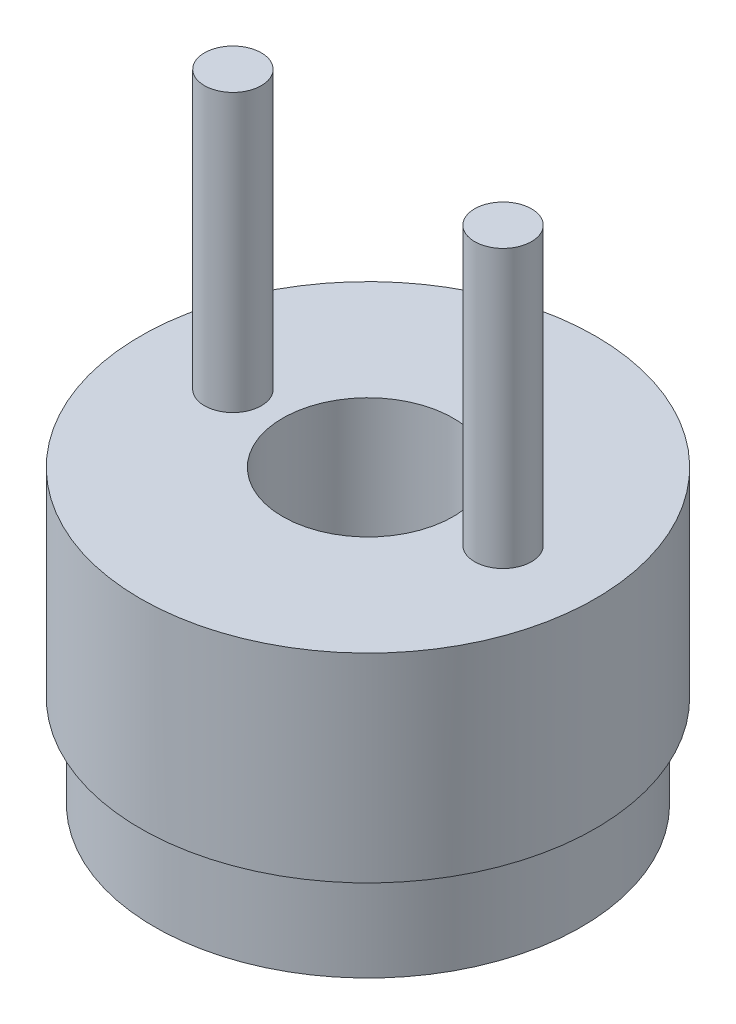
ISO-10303-21;
HEADER;
FILE_DESCRIPTION(('STEP AP214'),'2;1');
FILE_NAME('part.step','',(''),(''),'','','');
FILE_SCHEMA(('AUTOMOTIVE_DESIGN { 1 0 10303 214 1 1 1 1 }'));
ENDSEC;
DATA;
#1=APPLICATION_CONTEXT('core data for automotive mechanical design processes');
#2=APPLICATION_PROTOCOL_DEFINITION('international standard','automotive_design',2000,#1);
#3=PRODUCT_CONTEXT('',#1,'mechanical');
#4=PRODUCT('Part','Part','',(#3));
#5=PRODUCT_RELATED_PRODUCT_CATEGORY('part','',(#4));
#6=PRODUCT_DEFINITION_FORMATION('','',#4);
#7=PRODUCT_DEFINITION_CONTEXT('part definition',#1,'design');
#8=PRODUCT_DEFINITION('design','',#6,#7);
#9=PRODUCT_DEFINITION_SHAPE('','',#8);
#10=(LENGTH_UNIT() NAMED_UNIT(*) SI_UNIT(.MILLI.,.METRE.));
#11=(NAMED_UNIT(*) PLANE_ANGLE_UNIT() SI_UNIT($,.RADIAN.));
#12=(NAMED_UNIT(*) SI_UNIT($,.STERADIAN.) SOLID_ANGLE_UNIT());
#13=UNCERTAINTY_MEASURE_WITH_UNIT(LENGTH_MEASURE(1.E-05),#10,'distance_accuracy_value','');
#14=(GEOMETRIC_REPRESENTATION_CONTEXT(3) GLOBAL_UNCERTAINTY_ASSIGNED_CONTEXT((#13)) GLOBAL_UNIT_ASSIGNED_CONTEXT((#10,
#11,#12)) REPRESENTATION_CONTEXT('',''));
#15=CARTESIAN_POINT('',(0.,0.,0.));
#16=DIRECTION('',(0.,0.,1.));
#17=DIRECTION('',(1.,0.,0.));
#18=AXIS2_PLACEMENT_3D('',#15,#16,#17);
#19=CARTESIAN_POINT('',(9.5,59.5,0.));
#20=DIRECTION('',(0.,-1.,0.));
#21=DIRECTION('',(0.,0.,-1.));
#22=AXIS2_PLACEMENT_3D('',#19,#20,#21);
#23=CYLINDRICAL_SURFACE('',#22,2.);
#24=CARTESIAN_POINT('',(9.5,59.5,0.));
#25=DIRECTION('',(0.,1.,0.));
#26=DIRECTION('',(0.,0.,-1.));
#27=AXIS2_PLACEMENT_3D('',#24,#25,#26);
#28=CIRCLE('',#27,2.);
#29=CARTESIAN_POINT('',(9.5,59.5,-2.));
#30=VERTEX_POINT('',#29);
#31=EDGE_CURVE('E11',#30,#30,#28,.T.);
#32=ORIENTED_EDGE('',*,*,#31,.F.);
#33=EDGE_LOOP('',(#32));
#34=FACE_BOUND('',#33,.T.);
#35=CARTESIAN_POINT('',(9.5,19.5,0.));
#36=DIRECTION('',(0.,1.,0.));
#37=DIRECTION('',(0.,0.,-1.));
#38=AXIS2_PLACEMENT_3D('',#35,#36,#37);
#39=CIRCLE('',#38,2.);
#40=CARTESIAN_POINT('',(9.5,19.5,-2.));
#41=VERTEX_POINT('',#40);
#42=EDGE_CURVE('E45',#41,#41,#39,.T.);
#43=ORIENTED_EDGE('',*,*,#42,.T.);
#44=EDGE_LOOP('',(#43));
#45=FACE_BOUND('',#44,.T.);
#46=ADVANCED_FACE('F42',(#34,#45),#23,.T.);
#47=CARTESIAN_POINT('',(9.5,59.5,0.));
#48=DIRECTION('',(0.,-1.,0.));
#49=DIRECTION('',(0.,0.,-1.));
#50=AXIS2_PLACEMENT_3D('',#47,#48,#49);
#51=PLANE('',#50);
#52=ORIENTED_EDGE('',*,*,#31,.T.);
#53=EDGE_LOOP('',(#52));
#54=FACE_BOUND('',#53,.T.);
#55=ADVANCED_FACE('F57',(#54),#51,.F.);
#56=CARTESIAN_POINT('',(9.5,19.5,0.));
#57=DIRECTION('',(0.,-1.,0.));
#58=DIRECTION('',(0.,0.,-1.));
#59=AXIS2_PLACEMENT_3D('',#56,#57,#58);
#60=PLANE('',#59);
#61=ORIENTED_EDGE('',*,*,#42,.F.);
#62=EDGE_LOOP('',(#61));
#63=FACE_BOUND('',#62,.T.);
#64=ADVANCED_FACE('F55',(#63),#60,.T.);
#65=CLOSED_SHELL('',(#46,#55,#64));
#66=MANIFOLD_SOLID_BREP('B2',#65);
#67=CARTESIAN_POINT('',(-9.5,59.5,0.));
#68=DIRECTION('',(0.,-1.,0.));
#69=DIRECTION('',(0.,0.,-1.));
#70=AXIS2_PLACEMENT_3D('',#67,#68,#69);
#71=CYLINDRICAL_SURFACE('',#70,2.);
#72=CARTESIAN_POINT('',(-9.5,59.5,0.));
#73=DIRECTION('',(0.,1.,0.));
#74=DIRECTION('',(0.,0.,1.));
#75=AXIS2_PLACEMENT_3D('',#72,#73,#74);
#76=CIRCLE('',#75,2.);
#77=CARTESIAN_POINT('',(-9.5,59.5,2.));
#78=VERTEX_POINT('',#77);
#79=EDGE_CURVE('E41',#78,#78,#76,.T.);
#80=ORIENTED_EDGE('',*,*,#79,.F.);
#81=EDGE_LOOP('',(#80));
#82=FACE_BOUND('',#81,.T.);
#83=CARTESIAN_POINT('',(-9.5,19.5,0.));
#84=DIRECTION('',(0.,1.,0.));
#85=DIRECTION('',(0.,0.,1.));
#86=AXIS2_PLACEMENT_3D('',#83,#84,#85);
#87=CIRCLE('',#86,2.);
#88=CARTESIAN_POINT('',(-9.5,19.5,2.));
#89=VERTEX_POINT('',#88);
#90=EDGE_CURVE('E93',#89,#89,#87,.T.);
#91=ORIENTED_EDGE('',*,*,#90,.T.);
#92=EDGE_LOOP('',(#91));
#93=FACE_BOUND('',#92,.T.);
#94=ADVANCED_FACE('F90',(#82,#93),#71,.T.);
#95=CARTESIAN_POINT('',(-9.5,59.5,0.));
#96=DIRECTION('',(0.,1.,0.));
#97=DIRECTION('',(0.,0.,1.));
#98=AXIS2_PLACEMENT_3D('',#95,#96,#97);
#99=PLANE('',#98);
#100=ORIENTED_EDGE('',*,*,#79,.T.);
#101=EDGE_LOOP('',(#100));
#102=FACE_BOUND('',#101,.T.);
#103=ADVANCED_FACE('F105',(#102),#99,.T.);
#104=CARTESIAN_POINT('',(-9.5,19.5,0.));
#105=DIRECTION('',(0.,1.,0.));
#106=DIRECTION('',(0.,0.,1.));
#107=AXIS2_PLACEMENT_3D('',#104,#105,#106);
#108=PLANE('',#107);
#109=ORIENTED_EDGE('',*,*,#90,.F.);
#110=EDGE_LOOP('',(#109));
#111=FACE_BOUND('',#110,.T.);
#112=ADVANCED_FACE('F103',(#111),#108,.F.);
#113=CLOSED_SHELL('',(#94,#103,#112));
#114=MANIFOLD_SOLID_BREP('B6',#113);
#115=CARTESIAN_POINT('',(0.,0.,0.));
#116=DIRECTION('',(0.,1.,0.));
#117=DIRECTION('',(0.,0.,1.));
#118=AXIS2_PLACEMENT_3D('',#115,#116,#117);
#119=CYLINDRICAL_SURFACE('',#118,6.);
#120=CARTESIAN_POINT('',(0.,40.,0.));
#121=DIRECTION('',(0.,1.,0.));
#122=DIRECTION('',(0.,0.,1.));
#123=AXIS2_PLACEMENT_3D('',#120,#121,#122);
#124=CIRCLE('',#123,6.);
#125=CARTESIAN_POINT('',(0.,40.,6.));
#126=VERTEX_POINT('',#125);
#127=EDGE_CURVE('E139',#126,#126,#124,.T.);
#128=ORIENTED_EDGE('',*,*,#127,.T.);
#129=EDGE_LOOP('',(#128));
#130=FACE_BOUND('',#129,.T.);
#131=CARTESIAN_POINT('',(0.,19.5,0.));
#132=DIRECTION('',(0.,-1.,0.));
#133=DIRECTION('',(0.,0.,-1.));
#134=AXIS2_PLACEMENT_3D('',#131,#132,#133);
#135=CIRCLE('',#134,6.);
#136=CARTESIAN_POINT('',(0.,19.5,-6.));
#137=VERTEX_POINT('',#136);
#138=EDGE_CURVE('E167',#137,#137,#135,.F.);
#139=ORIENTED_EDGE('',*,*,#138,.F.);
#140=EDGE_LOOP('',(#139));
#141=FACE_BOUND('',#140,.T.);
#142=ADVANCED_FACE('F131',(#130,#141),#119,.F.);
#143=CARTESIAN_POINT('',(0.,26.,0.));
#144=DIRECTION('',(0.,-1.,0.));
#145=DIRECTION('',(0.,0.,-1.));
#146=AXIS2_PLACEMENT_3D('',#143,#144,#145);
#147=CYLINDRICAL_SURFACE('',#146,15.);
#148=CARTESIAN_POINT('',(0.,26.,0.));
#149=DIRECTION('',(0.,-1.,0.));
#150=DIRECTION('',(0.,0.,-1.));
#151=AXIS2_PLACEMENT_3D('',#148,#149,#150);
#152=CIRCLE('',#151,15.);
#153=CARTESIAN_POINT('',(0.,26.,-15.));
#154=VERTEX_POINT('',#153);
#155=EDGE_CURVE('E149',#154,#154,#152,.T.);
#156=CARTESIAN_POINT('',(0.,19.5,0.));
#157=DIRECTION('',(0.,-1.,0.));
#158=DIRECTION('',(0.,0.,-1.));
#159=AXIS2_PLACEMENT_3D('',#156,#157,#158);
#160=CIRCLE('',#159,15.);
#161=CARTESIAN_POINT('',(0.,19.5,-15.));
#162=VERTEX_POINT('',#161);
#163=EDGE_CURVE('E157',#162,#162,#160,.T.);
#164=CARTESIAN_POINT('',(0.,26.,-15.));
#165=CARTESIAN_POINT('',(0.,25.9322916666667,-15.));
#166=CARTESIAN_POINT('',(0.,25.8645833333333,-15.));
#167=CARTESIAN_POINT('',(0.,25.7291666666667,-15.));
#168=CARTESIAN_POINT('',(0.,25.6614583333333,-15.));
#169=CARTESIAN_POINT('',(0.,25.5260416666667,-15.));
#170=CARTESIAN_POINT('',(0.,25.4583333333333,-15.));
#171=CARTESIAN_POINT('',(0.,25.3229166666667,-15.));
#172=CARTESIAN_POINT('',(0.,25.2552083333333,-15.));
#173=CARTESIAN_POINT('',(0.,25.1197916666667,-15.));
#174=CARTESIAN_POINT('',(0.,25.0520833333333,-15.));
#175=CARTESIAN_POINT('',(0.,24.9166666666667,-15.));
#176=CARTESIAN_POINT('',(0.,24.8489583333333,-15.));
#177=CARTESIAN_POINT('',(0.,24.7135416666667,-15.));
#178=CARTESIAN_POINT('',(0.,24.6458333333333,-15.));
#179=CARTESIAN_POINT('',(0.,24.5104166666667,-15.));
#180=CARTESIAN_POINT('',(0.,24.4427083333333,-15.));
#181=CARTESIAN_POINT('',(0.,24.3072916666667,-15.));
#182=CARTESIAN_POINT('',(0.,24.2395833333333,-15.));
#183=CARTESIAN_POINT('',(0.,24.1041666666667,-15.));
#184=CARTESIAN_POINT('',(0.,24.0364583333333,-15.));
#185=CARTESIAN_POINT('',(0.,23.9010416666667,-15.));
#186=CARTESIAN_POINT('',(0.,23.8333333333333,-15.));
#187=CARTESIAN_POINT('',(0.,23.6979166666667,-15.));
#188=CARTESIAN_POINT('',(0.,23.6302083333333,-15.));
#189=CARTESIAN_POINT('',(0.,23.4947916666667,-15.));
#190=CARTESIAN_POINT('',(0.,23.4270833333333,-15.));
#191=CARTESIAN_POINT('',(0.,23.2916666666667,-15.));
#192=CARTESIAN_POINT('',(0.,23.2239583333333,-15.));
#193=CARTESIAN_POINT('',(0.,23.0885416666667,-15.));
#194=CARTESIAN_POINT('',(0.,23.0208333333333,-15.));
#195=CARTESIAN_POINT('',(0.,22.8854166666667,-15.));
#196=CARTESIAN_POINT('',(0.,22.8177083333333,-15.));
#197=CARTESIAN_POINT('',(0.,22.6822916666667,-15.));
#198=CARTESIAN_POINT('',(0.,22.6145833333333,-15.));
#199=CARTESIAN_POINT('',(0.,22.4791666666667,-15.));
#200=CARTESIAN_POINT('',(0.,22.4114583333333,-15.));
#201=CARTESIAN_POINT('',(0.,22.2760416666667,-15.));
#202=CARTESIAN_POINT('',(0.,22.2083333333333,-15.));
#203=CARTESIAN_POINT('',(0.,22.0729166666667,-15.));
#204=CARTESIAN_POINT('',(0.,22.0052083333333,-15.));
#205=CARTESIAN_POINT('',(0.,21.8697916666667,-15.));
#206=CARTESIAN_POINT('',(0.,21.8020833333333,-15.));
#207=CARTESIAN_POINT('',(0.,21.6666666666667,-15.));
#208=CARTESIAN_POINT('',(0.,21.5989583333333,-15.));
#209=CARTESIAN_POINT('',(0.,21.4635416666667,-15.));
#210=CARTESIAN_POINT('',(0.,21.3958333333333,-15.));
#211=CARTESIAN_POINT('',(0.,21.2604166666667,-15.));
#212=CARTESIAN_POINT('',(0.,21.1927083333333,-15.));
#213=CARTESIAN_POINT('',(0.,21.0572916666667,-15.));
#214=CARTESIAN_POINT('',(0.,20.9895833333333,-15.));
#215=CARTESIAN_POINT('',(0.,20.8541666666667,-15.));
#216=CARTESIAN_POINT('',(0.,20.7864583333333,-15.));
#217=CARTESIAN_POINT('',(0.,20.6510416666667,-15.));
#218=CARTESIAN_POINT('',(0.,20.5833333333333,-15.));
#219=CARTESIAN_POINT('',(0.,20.4479166666667,-15.));
#220=CARTESIAN_POINT('',(0.,20.3802083333333,-15.));
#221=CARTESIAN_POINT('',(0.,20.2447916666667,-15.));
#222=CARTESIAN_POINT('',(0.,20.1770833333333,-15.));
#223=CARTESIAN_POINT('',(0.,20.0416666666667,-15.));
#224=CARTESIAN_POINT('',(0.,19.9739583333333,-15.));
#225=CARTESIAN_POINT('',(0.,19.8385416666667,-15.));
#226=CARTESIAN_POINT('',(0.,19.7708333333333,-15.));
#227=CARTESIAN_POINT('',(0.,19.6354166666667,-15.));
#228=CARTESIAN_POINT('',(0.,19.5677083333333,-15.));
#229=CARTESIAN_POINT('',(0.,19.5,-15.));
#230=B_SPLINE_CURVE_WITH_KNOTS('',3,(#164,#165,#166,#167,#168,#169,#170,#171,#172,#173,#174,
#175,#176,#177,#178,#179,#180,#181,#182,#183,#184,#185,#186,#187,#188,#189,#190,#191,#192,#193,
#194,#195,#196,#197,#198,#199,#200,#201,#202,#203,#204,#205,#206,#207,#208,#209,#210,#211,#212,
#213,#214,#215,#216,#217,#218,#219,#220,#221,#222,#223,#224,#225,#226,#227,#228,#229),
.UNSPECIFIED.,.F.,.F.,(4,2,2,2,2,2,2,2,2,2,2,2,2,2,2,2,2,2,2,2,2,2,2,2,2,2,2,2,2,2,2,2,4),(0.,
0.203124999999998,0.406249999999997,0.609374999999999,0.812499999999997,1.015625,1.21875,
1.421875,1.625,1.828125,2.03125,2.234375,2.4375,2.640625,2.84375,3.046875,3.25,3.453125,3.65625,
3.859375,4.0625,4.265625,4.46875,4.671875,4.875,5.078125,5.28125,5.484375,5.6875,5.890625,
6.09375,6.296875,6.5),.UNSPECIFIED.);
#231=EDGE_CURVE('BSEAM172',#154,#162,#230,.T.);
#232=ORIENTED_EDGE('',*,*,#155,.T.);
#233=ORIENTED_EDGE('',*,*,#163,.F.);
#234=ORIENTED_EDGE('',*,*,#231,.T.);
#235=ORIENTED_EDGE('',*,*,#231,.F.);
#236=EDGE_LOOP('',(#232,#234,#233,#235));
#237=FACE_BOUND('',#236,.T.);
#238=ADVANCED_FACE('F172',(#237),#147,.T.);
#239=CARTESIAN_POINT('',(0.,40.,0.));
#240=DIRECTION('',(0.,-1.,0.));
#241=DIRECTION('',(0.,0.,-1.));
#242=AXIS2_PLACEMENT_3D('',#239,#240,#241);
#243=CYLINDRICAL_SURFACE('',#242,16.);
#244=CARTESIAN_POINT('',(0.,40.,0.));
#245=DIRECTION('',(0.,1.,0.));
#246=DIRECTION('',(0.,0.,1.));
#247=AXIS2_PLACEMENT_3D('',#244,#245,#246);
#248=CIRCLE('',#247,16.);
#249=CARTESIAN_POINT('',(0.,40.,16.));
#250=VERTEX_POINT('',#249);
#251=EDGE_CURVE('E89',#250,#250,#248,.T.);
#252=ORIENTED_EDGE('',*,*,#251,.F.);
#253=EDGE_LOOP('',(#252));
#254=FACE_BOUND('',#253,.T.);
#255=CARTESIAN_POINT('',(0.,26.,0.));
#256=DIRECTION('',(0.,-1.,0.));
#257=DIRECTION('',(0.,0.,-1.));
#258=AXIS2_PLACEMENT_3D('',#255,#256,#257);
#259=CIRCLE('',#258,16.);
#260=CARTESIAN_POINT('',(0.,26.,-16.));
#261=VERTEX_POINT('',#260);
#262=EDGE_CURVE('E144',#261,#261,#259,.T.);
#263=ORIENTED_EDGE('',*,*,#262,.F.);
#264=EDGE_LOOP('',(#263));
#265=FACE_BOUND('',#264,.T.);
#266=ADVANCED_FACE('F133',(#254,#265),#243,.T.);
#267=CARTESIAN_POINT('',(0.,40.,0.));
#268=DIRECTION('',(0.,1.,0.));
#269=DIRECTION('',(0.,0.,1.));
#270=AXIS2_PLACEMENT_3D('',#267,#268,#269);
#271=PLANE('',#270);
#272=CARTESIAN_POINT('',(9.5,40.,0.));
#273=DIRECTION('',(0.,1.,0.));
#274=DIRECTION('',(0.,0.,1.));
#275=AXIS2_PLACEMENT_3D('',#272,#273,#274);
#276=CIRCLE('',#275,2.);
#277=CARTESIAN_POINT('',(9.5,40.,2.));
#278=VERTEX_POINT('',#277);
#279=EDGE_CURVE('E153',#278,#278,#276,.T.);
#280=ORIENTED_EDGE('',*,*,#279,.F.);
#281=EDGE_LOOP('',(#280));
#282=FACE_BOUND('',#281,.T.);
#283=CARTESIAN_POINT('',(-9.5,40.,0.));
#284=DIRECTION('',(0.,1.,0.));
#285=DIRECTION('',(0.,0.,1.));
#286=AXIS2_PLACEMENT_3D('',#283,#284,#285);
#287=CIRCLE('',#286,2.);
#288=CARTESIAN_POINT('',(-9.5,40.,2.));
#289=VERTEX_POINT('',#288);
#290=EDGE_CURVE('E152',#289,#289,#287,.T.);
#291=ORIENTED_EDGE('',*,*,#290,.F.);
#292=EDGE_LOOP('',(#291));
#293=FACE_BOUND('',#292,.T.);
#294=ORIENTED_EDGE('',*,*,#127,.F.);
#295=EDGE_LOOP('',(#294));
#296=FACE_BOUND('',#295,.T.);
#297=ORIENTED_EDGE('',*,*,#251,.T.);
#298=EDGE_LOOP('',(#297));
#299=FACE_BOUND('',#298,.T.);
#300=ADVANCED_FACE('F179',(#282,#293,#296,#299),#271,.T.);
#301=CARTESIAN_POINT('',(0.,26.,0.));
#302=DIRECTION('',(0.,-1.,0.));
#303=DIRECTION('',(0.,0.,-1.));
#304=AXIS2_PLACEMENT_3D('',#301,#302,#303);
#305=PLANE('',#304);
#306=ORIENTED_EDGE('',*,*,#155,.F.);
#307=EDGE_LOOP('',(#306));
#308=FACE_BOUND('',#307,.T.);
#309=ORIENTED_EDGE('',*,*,#262,.T.);
#310=EDGE_LOOP('',(#309));
#311=FACE_BOUND('',#310,.T.);
#312=ADVANCED_FACE('F175',(#308,#311),#305,.T.);
#313=CARTESIAN_POINT('',(0.,19.5,0.));
#314=DIRECTION('',(0.,-1.,0.));
#315=DIRECTION('',(0.,0.,-1.));
#316=AXIS2_PLACEMENT_3D('',#313,#314,#315);
#317=PLANE('',#316);
#318=CARTESIAN_POINT('',(9.5,19.5,0.));
#319=DIRECTION('',(0.,-1.,0.));
#320=DIRECTION('',(0.,0.,-1.));
#321=AXIS2_PLACEMENT_3D('',#318,#319,#320);
#322=CIRCLE('',#321,2.);
#323=CARTESIAN_POINT('',(9.5,19.5,-2.));
#324=VERTEX_POINT('',#323);
#325=EDGE_CURVE('E135',#324,#324,#322,.T.);
#326=ORIENTED_EDGE('',*,*,#325,.F.);
#327=EDGE_LOOP('',(#326));
#328=FACE_BOUND('',#327,.T.);
#329=CARTESIAN_POINT('',(-9.5,19.5,0.));
#330=DIRECTION('',(0.,-1.,0.));
#331=DIRECTION('',(0.,0.,-1.));
#332=AXIS2_PLACEMENT_3D('',#329,#330,#331);
#333=CIRCLE('',#332,2.);
#334=CARTESIAN_POINT('',(-9.5,19.5,-2.));
#335=VERTEX_POINT('',#334);
#336=EDGE_CURVE('E150',#335,#335,#333,.T.);
#337=ORIENTED_EDGE('',*,*,#336,.F.);
#338=EDGE_LOOP('',(#337));
#339=FACE_BOUND('',#338,.T.);
#340=ORIENTED_EDGE('',*,*,#163,.T.);
#341=EDGE_LOOP('',(#340));
#342=FACE_BOUND('',#341,.T.);
#343=ORIENTED_EDGE('',*,*,#138,.T.);
#344=EDGE_LOOP('',(#343));
#345=FACE_BOUND('',#344,.T.);
#346=ADVANCED_FACE('F178',(#328,#339,#342,#345),#317,.T.);
#347=CARTESIAN_POINT('',(-9.5,59.5,0.));
#348=DIRECTION('',(0.,-1.,0.));
#349=DIRECTION('',(0.,0.,-1.));
#350=AXIS2_PLACEMENT_3D('',#347,#348,#349);
#351=CYLINDRICAL_SURFACE('',#350,2.);
#352=ORIENTED_EDGE('',*,*,#290,.T.);
#353=EDGE_LOOP('',(#352));
#354=FACE_BOUND('',#353,.T.);
#355=ORIENTED_EDGE('',*,*,#336,.T.);
#356=EDGE_LOOP('',(#355));
#357=FACE_BOUND('',#356,.T.);
#358=ADVANCED_FACE('F200',(#354,#357),#351,.F.);
#359=CARTESIAN_POINT('',(9.5,59.5,0.));
#360=DIRECTION('',(0.,-1.,0.));
#361=DIRECTION('',(0.,0.,-1.));
#362=AXIS2_PLACEMENT_3D('',#359,#360,#361);
#363=CYLINDRICAL_SURFACE('',#362,2.);
#364=ORIENTED_EDGE('',*,*,#279,.T.);
#365=EDGE_LOOP('',(#364));
#366=FACE_BOUND('',#365,.T.);
#367=ORIENTED_EDGE('',*,*,#325,.T.);
#368=EDGE_LOOP('',(#367));
#369=FACE_BOUND('',#368,.T.);
#370=ADVANCED_FACE('F204',(#366,#369),#363,.F.);
#371=CLOSED_SHELL('',(#142,#238,#266,#300,#312,#346,#358,#370));
#372=MANIFOLD_SOLID_BREP('B36',#371);
#373=ADVANCED_BREP_SHAPE_REPRESENTATION('',(#18,#66,#114,#372),#14);
#374=SHAPE_DEFINITION_REPRESENTATION(#9,#373);
ENDSEC;
END-ISO-10303-21;
